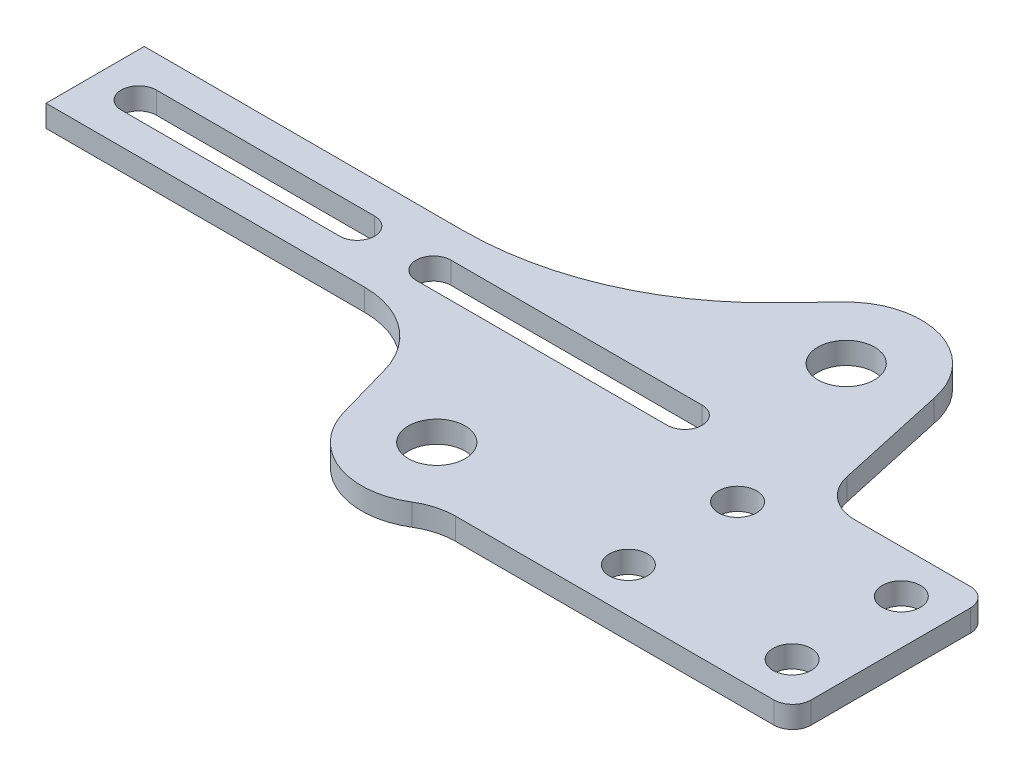
ISO-10303-21;
HEADER;
FILE_DESCRIPTION(('STEP AP214'),'2;1');
FILE_NAME('part.step','',(''),(''),'','','');
FILE_SCHEMA(('AUTOMOTIVE_DESIGN { 1 0 10303 214 1 1 1 1 }'));
ENDSEC;
DATA;
#1=APPLICATION_CONTEXT('core data for automotive mechanical design processes');
#2=APPLICATION_PROTOCOL_DEFINITION('international standard','automotive_design',2000,#1);
#3=PRODUCT_CONTEXT('',#1,'mechanical');
#4=PRODUCT('Part','Part','',(#3));
#5=PRODUCT_RELATED_PRODUCT_CATEGORY('part','',(#4));
#6=PRODUCT_DEFINITION_FORMATION('','',#4);
#7=PRODUCT_DEFINITION_CONTEXT('part definition',#1,'design');
#8=PRODUCT_DEFINITION('design','',#6,#7);
#9=PRODUCT_DEFINITION_SHAPE('','',#8);
#10=(LENGTH_UNIT() NAMED_UNIT(*) SI_UNIT(.MILLI.,.METRE.));
#11=(NAMED_UNIT(*) PLANE_ANGLE_UNIT() SI_UNIT($,.RADIAN.));
#12=(NAMED_UNIT(*) SI_UNIT($,.STERADIAN.) SOLID_ANGLE_UNIT());
#13=UNCERTAINTY_MEASURE_WITH_UNIT(LENGTH_MEASURE(1.E-05),#10,'distance_accuracy_value','');
#14=(GEOMETRIC_REPRESENTATION_CONTEXT(3) GLOBAL_UNCERTAINTY_ASSIGNED_CONTEXT((#13)) GLOBAL_UNIT_ASSIGNED_CONTEXT((#10,
#11,#12)) REPRESENTATION_CONTEXT('',''));
#15=CARTESIAN_POINT('',(0.,0.,0.));
#16=DIRECTION('',(0.,0.,1.));
#17=DIRECTION('',(1.,0.,0.));
#18=AXIS2_PLACEMENT_3D('',#15,#16,#17);
#19=CARTESIAN_POINT('',(0.,2.,-14.));
#20=DIRECTION('',(0.,0.,-1.));
#21=DIRECTION('',(-1.,0.,0.));
#22=AXIS2_PLACEMENT_3D('',#19,#20,#21);
#23=PLANE('',#22);
#24=DIRECTION('',(1.,0.,0.));
#25=VECTOR('',#24,1.);
#26=CARTESIAN_POINT('',(0.,0.,-14.));
#27=LINE('',#26,#25);
#28=CARTESIAN_POINT('',(6.79440726035871,0.,-14.));
#29=VERTEX_POINT('',#28);
#30=CARTESIAN_POINT('',(17.3739461759441,0.,-14.));
#31=VERTEX_POINT('',#30);
#32=EDGE_CURVE('E510',#29,#31,#27,.T.);
#33=ORIENTED_EDGE('',*,*,#32,.F.);
#34=DIRECTION('',(0.,-1.,0.));
#35=VECTOR('',#34,1.);
#36=CARTESIAN_POINT('',(6.79440726035871,2.,-14.));
#37=LINE('',#36,#35);
#38=CARTESIAN_POINT('',(6.79440726035871,2.,-14.));
#39=VERTEX_POINT('',#38);
#40=EDGE_CURVE('E374',#39,#29,#37,.T.);
#41=ORIENTED_EDGE('',*,*,#40,.F.);
#42=DIRECTION('',(1.,0.,0.));
#43=VECTOR('',#42,1.);
#44=CARTESIAN_POINT('',(0.,2.,-14.));
#45=LINE('',#44,#43);
#46=CARTESIAN_POINT('',(17.3739461759441,2.,-14.));
#47=VERTEX_POINT('',#46);
#48=EDGE_CURVE('E472',#39,#47,#45,.T.);
#49=ORIENTED_EDGE('',*,*,#48,.T.);
#50=DIRECTION('',(0.,-1.,0.));
#51=VECTOR('',#50,1.);
#52=CARTESIAN_POINT('',(17.3739461759441,2.,-14.));
#53=LINE('',#52,#51);
#54=EDGE_CURVE('E482',#47,#31,#53,.T.);
#55=ORIENTED_EDGE('',*,*,#54,.T.);
#56=EDGE_LOOP('',(#33,#41,#49,#55));
#57=FACE_BOUND('',#56,.T.);
#58=ADVANCED_FACE('F45',(#57),#23,.T.);
#59=CARTESIAN_POINT('',(0.,2.,-19.0035259776527));
#60=DIRECTION('',(0.,0.,-1.));
#61=DIRECTION('',(-1.,0.,0.));
#62=AXIS2_PLACEMENT_3D('',#59,#60,#61);
#63=PLANE('',#62);
#64=DIRECTION('',(1.,0.,0.));
#65=VECTOR('',#64,1.);
#66=CARTESIAN_POINT('',(0.,2.,-19.0035259776527));
#67=LINE('',#66,#65);
#68=CARTESIAN_POINT('',(-63.2934722012444,2.,-19.0035259776527));
#69=VERTEX_POINT('',#68);
#70=CARTESIAN_POINT('',(-34.1349039997192,2.,-19.0035259776527));
#71=VERTEX_POINT('',#70);
#72=EDGE_CURVE('E475',#69,#71,#67,.T.);
#73=ORIENTED_EDGE('',*,*,#72,.T.);
#74=DIRECTION('',(0.,1.,0.));
#75=VECTOR('',#74,1.);
#76=CARTESIAN_POINT('',(-34.1349039997192,0.,-19.0035259776527));
#77=LINE('',#76,#75);
#78=CARTESIAN_POINT('',(-34.1349039997192,0.,-19.0035259776527));
#79=VERTEX_POINT('',#78);
#80=EDGE_CURVE('E406',#79,#71,#77,.T.);
#81=ORIENTED_EDGE('',*,*,#80,.F.);
#82=DIRECTION('',(1.,0.,0.));
#83=VECTOR('',#82,1.);
#84=CARTESIAN_POINT('',(0.,0.,-19.0035259776527));
#85=LINE('',#84,#83);
#86=CARTESIAN_POINT('',(-63.2934722012444,0.,-19.0035259776527));
#87=VERTEX_POINT('',#86);
#88=EDGE_CURVE('E513',#87,#79,#85,.T.);
#89=ORIENTED_EDGE('',*,*,#88,.F.);
#90=DIRECTION('',(0.,1.,0.));
#91=VECTOR('',#90,1.);
#92=CARTESIAN_POINT('',(-63.2934722012444,0.,-19.0035259776527));
#93=LINE('',#92,#91);
#94=EDGE_CURVE('E273',#87,#69,#93,.T.);
#95=ORIENTED_EDGE('',*,*,#94,.T.);
#96=EDGE_LOOP('',(#73,#81,#89,#95));
#97=FACE_BOUND('',#96,.T.);
#98=ADVANCED_FACE('F575',(#97),#63,.T.);
#99=CARTESIAN_POINT('',(0.,2.,-10.0035259776527));
#100=DIRECTION('',(0.,0.,1.));
#101=DIRECTION('',(1.,0.,0.));
#102=AXIS2_PLACEMENT_3D('',#99,#100,#101);
#103=PLANE('',#102);
#104=DIRECTION('',(-1.,0.,0.));
#105=VECTOR('',#104,1.);
#106=CARTESIAN_POINT('',(0.,0.,-10.0035259776527));
#107=LINE('',#106,#105);
#108=CARTESIAN_POINT('',(-34.0979895375053,0.,-10.0035259776527));
#109=VERTEX_POINT('',#108);
#110=CARTESIAN_POINT('',(-63.2934722012444,0.,-10.0035259776527));
#111=VERTEX_POINT('',#110);
#112=EDGE_CURVE('E448',#109,#111,#107,.T.);
#113=ORIENTED_EDGE('',*,*,#112,.F.);
#114=DIRECTION('',(0.,1.,0.));
#115=VECTOR('',#114,1.);
#116=CARTESIAN_POINT('',(-34.0979895375053,0.,-10.0035259776527));
#117=LINE('',#116,#115);
#118=CARTESIAN_POINT('',(-34.0979895375053,2.,-10.0035259776527));
#119=VERTEX_POINT('',#118);
#120=EDGE_CURVE('E431',#109,#119,#117,.T.);
#121=ORIENTED_EDGE('',*,*,#120,.T.);
#122=DIRECTION('',(-1.,0.,0.));
#123=VECTOR('',#122,1.);
#124=CARTESIAN_POINT('',(0.,2.,-10.0035259776527));
#125=LINE('',#124,#123);
#126=CARTESIAN_POINT('',(-63.2934722012444,2.,-10.0035259776527));
#127=VERTEX_POINT('',#126);
#128=EDGE_CURVE('E479',#119,#127,#125,.T.);
#129=ORIENTED_EDGE('',*,*,#128,.T.);
#130=DIRECTION('',(0.,1.,0.));
#131=VECTOR('',#130,1.);
#132=CARTESIAN_POINT('',(-63.2934722012444,0.,-10.0035259776527));
#133=LINE('',#132,#131);
#134=EDGE_CURVE('E268',#111,#127,#133,.T.);
#135=ORIENTED_EDGE('',*,*,#134,.F.);
#136=EDGE_LOOP('',(#113,#121,#129,#135));
#137=FACE_BOUND('',#136,.T.);
#138=ADVANCED_FACE('F565',(#137),#103,.T.);
#139=CARTESIAN_POINT('',(0.,2.,3.99647402234725));
#140=DIRECTION('',(0.,0.,1.));
#141=DIRECTION('',(1.,0.,0.));
#142=AXIS2_PLACEMENT_3D('',#139,#140,#141);
#143=PLANE('',#142);
#144=DIRECTION('',(-1.,0.,0.));
#145=VECTOR('',#144,1.);
#146=CARTESIAN_POINT('',(0.,2.,3.99647402234725));
#147=LINE('',#146,#145);
#148=CARTESIAN_POINT('',(17.3739461759441,2.,3.99647402234725));
#149=VERTEX_POINT('',#148);
#150=CARTESIAN_POINT('',(-11.7678988907769,2.,3.99647402234725));
#151=VERTEX_POINT('',#150);
#152=EDGE_CURVE('E468',#149,#151,#147,.T.);
#153=ORIENTED_EDGE('',*,*,#152,.T.);
#154=DIRECTION('',(0.,-1.,0.));
#155=VECTOR('',#154,1.);
#156=CARTESIAN_POINT('',(-11.7678988907769,0.,3.99647402234725));
#157=LINE('',#156,#155);
#158=CARTESIAN_POINT('',(-11.7678988907769,0.,3.99647402234725));
#159=VERTEX_POINT('',#158);
#160=EDGE_CURVE('E530',#151,#159,#157,.T.);
#161=ORIENTED_EDGE('',*,*,#160,.T.);
#162=DIRECTION('',(-1.,0.,0.));
#163=VECTOR('',#162,1.);
#164=CARTESIAN_POINT('',(0.,0.,3.99647402234725));
#165=LINE('',#164,#163);
#166=CARTESIAN_POINT('',(17.3739461759441,0.,3.99647402234725));
#167=VERTEX_POINT('',#166);
#168=EDGE_CURVE('E506',#167,#159,#165,.T.);
#169=ORIENTED_EDGE('',*,*,#168,.F.);
#170=DIRECTION('',(0.,-1.,0.));
#171=VECTOR('',#170,1.);
#172=CARTESIAN_POINT('',(17.3739461759441,2.,3.99647402234725));
#173=LINE('',#172,#171);
#174=EDGE_CURVE('E522',#149,#167,#173,.T.);
#175=ORIENTED_EDGE('',*,*,#174,.F.);
#176=EDGE_LOOP('',(#153,#161,#169,#175));
#177=FACE_BOUND('',#176,.T.);
#178=ADVANCED_FACE('F544',(#177),#143,.T.);
#179=CARTESIAN_POINT('',(-5.99999999999999,2.,-26.0035259776527));
#180=DIRECTION('',(0.,-1.,0.));
#181=DIRECTION('',(0.,0.,-1.));
#182=AXIS2_PLACEMENT_3D('',#179,#180,#181);
#183=CYLINDRICAL_SURFACE('',#182,2.6);
#184=CARTESIAN_POINT('',(-5.99999999999999,2.,-26.0035259776527));
#185=DIRECTION('',(0.,1.,0.));
#186=DIRECTION('',(0.,0.,1.));
#187=AXIS2_PLACEMENT_3D('',#184,#185,#186);
#188=CIRCLE('',#187,2.6);
#189=CARTESIAN_POINT('',(-5.99999999999999,2.,-23.4035259776527));
#190=VERTEX_POINT('',#189);
#191=EDGE_CURVE('E464',#190,#190,#188,.T.);
#192=ORIENTED_EDGE('',*,*,#191,.T.);
#193=EDGE_LOOP('',(#192));
#194=FACE_BOUND('',#193,.T.);
#195=CARTESIAN_POINT('',(-5.99999999999999,0.,-26.0035259776527));
#196=DIRECTION('',(0.,1.,0.));
#197=DIRECTION('',(0.,0.,1.));
#198=AXIS2_PLACEMENT_3D('',#195,#196,#197);
#199=CIRCLE('',#198,2.6);
#200=CARTESIAN_POINT('',(-5.99999999999999,0.,-23.4035259776527));
#201=VERTEX_POINT('',#200);
#202=EDGE_CURVE('E502',#201,#201,#199,.T.);
#203=ORIENTED_EDGE('',*,*,#202,.F.);
#204=EDGE_LOOP('',(#203));
#205=FACE_BOUND('',#204,.T.);
#206=ADVANCED_FACE('F628',(#194,#205),#183,.F.);
#207=CARTESIAN_POINT('',(-18.5,2.,-1.00352597765274));
#208=DIRECTION('',(0.,-1.,0.));
#209=DIRECTION('',(0.,0.,-1.));
#210=AXIS2_PLACEMENT_3D('',#207,#208,#209);
#211=CYLINDRICAL_SURFACE('',#210,2.6);
#212=CARTESIAN_POINT('',(-18.5,2.,-1.00352597765274));
#213=DIRECTION('',(0.,1.,0.));
#214=DIRECTION('',(0.,0.,1.));
#215=AXIS2_PLACEMENT_3D('',#212,#213,#214);
#216=CIRCLE('',#215,2.6);
#217=CARTESIAN_POINT('',(-18.5,2.,1.59647402234726));
#218=VERTEX_POINT('',#217);
#219=EDGE_CURVE('E460',#218,#218,#216,.T.);
#220=ORIENTED_EDGE('',*,*,#219,.T.);
#221=EDGE_LOOP('',(#220));
#222=FACE_BOUND('',#221,.T.);
#223=CARTESIAN_POINT('',(-18.5,0.,-1.00352597765274));
#224=DIRECTION('',(0.,1.,0.));
#225=DIRECTION('',(0.,0.,1.));
#226=AXIS2_PLACEMENT_3D('',#223,#224,#225);
#227=CIRCLE('',#226,2.6);
#228=CARTESIAN_POINT('',(-18.5,0.,1.59647402234726));
#229=VERTEX_POINT('',#228);
#230=EDGE_CURVE('E498',#229,#229,#227,.T.);
#231=ORIENTED_EDGE('',*,*,#230,.F.);
#232=EDGE_LOOP('',(#231));
#233=FACE_BOUND('',#232,.T.);
#234=ADVANCED_FACE('F631',(#222,#233),#211,.F.);
#235=CARTESIAN_POINT('',(15.,2.,-10.0531735870855));
#236=DIRECTION('',(0.,-1.,0.));
#237=DIRECTION('',(0.,0.,-1.));
#238=AXIS2_PLACEMENT_3D('',#235,#236,#237);
#239=CYLINDRICAL_SURFACE('',#238,1.75);
#240=CARTESIAN_POINT('',(15.,2.,-10.0531735870855));
#241=DIRECTION('',(0.,1.,0.));
#242=DIRECTION('',(0.,0.,1.));
#243=AXIS2_PLACEMENT_3D('',#240,#241,#242);
#244=CIRCLE('',#243,1.75);
#245=CARTESIAN_POINT('',(15.,2.,-8.30317358708548));
#246=VERTEX_POINT('',#245);
#247=EDGE_CURVE('E456',#246,#246,#244,.T.);
#248=ORIENTED_EDGE('',*,*,#247,.T.);
#249=EDGE_LOOP('',(#248));
#250=FACE_BOUND('',#249,.T.);
#251=CARTESIAN_POINT('',(15.,0.,-10.0531735870855));
#252=DIRECTION('',(0.,1.,0.));
#253=DIRECTION('',(0.,0.,1.));
#254=AXIS2_PLACEMENT_3D('',#251,#252,#253);
#255=CIRCLE('',#254,1.75);
#256=CARTESIAN_POINT('',(15.,0.,-8.30317358708548));
#257=VERTEX_POINT('',#256);
#258=EDGE_CURVE('E494',#257,#257,#255,.T.);
#259=ORIENTED_EDGE('',*,*,#258,.F.);
#260=EDGE_LOOP('',(#259));
#261=FACE_BOUND('',#260,.T.);
#262=ADVANCED_FACE('F635',(#250,#261),#239,.F.);
#263=CARTESIAN_POINT('',(0.,2.,-10.0531735870854));
#264=DIRECTION('',(0.,-1.,0.));
#265=DIRECTION('',(0.,0.,-1.));
#266=AXIS2_PLACEMENT_3D('',#263,#264,#265);
#267=CYLINDRICAL_SURFACE('',#266,1.75);
#268=CARTESIAN_POINT('',(0.,2.,-10.0531735870854));
#269=DIRECTION('',(0.,1.,0.));
#270=DIRECTION('',(0.,0.,1.));
#271=AXIS2_PLACEMENT_3D('',#268,#269,#270);
#272=CIRCLE('',#271,1.75);
#273=CARTESIAN_POINT('',(0.,2.,-8.30317358708538));
#274=VERTEX_POINT('',#273);
#275=EDGE_CURVE('E452',#274,#274,#272,.T.);
#276=ORIENTED_EDGE('',*,*,#275,.T.);
#277=EDGE_LOOP('',(#276));
#278=FACE_BOUND('',#277,.T.);
#279=CARTESIAN_POINT('',(0.,0.,-10.0531735870854));
#280=DIRECTION('',(0.,1.,0.));
#281=DIRECTION('',(0.,0.,1.));
#282=AXIS2_PLACEMENT_3D('',#279,#280,#281);
#283=CIRCLE('',#282,1.75);
#284=CARTESIAN_POINT('',(0.,0.,-8.30317358708538));
#285=VERTEX_POINT('',#284);
#286=EDGE_CURVE('E490',#285,#285,#283,.T.);
#287=ORIENTED_EDGE('',*,*,#286,.F.);
#288=EDGE_LOOP('',(#287));
#289=FACE_BOUND('',#288,.T.);
#290=ADVANCED_FACE('F639',(#278,#289),#267,.F.);
#291=CARTESIAN_POINT('',(1.07552855510562E-13,2.,-0.0531735870853787));
#292=DIRECTION('',(0.,-1.,0.));
#293=DIRECTION('',(0.,0.,-1.));
#294=AXIS2_PLACEMENT_3D('',#291,#292,#293);
#295=CYLINDRICAL_SURFACE('',#294,1.75);
#296=CARTESIAN_POINT('',(1.07552855510562E-13,2.,-0.0531735870853787));
#297=DIRECTION('',(0.,1.,0.));
#298=DIRECTION('',(0.,0.,1.));
#299=AXIS2_PLACEMENT_3D('',#296,#297,#298);
#300=CIRCLE('',#299,1.75);
#301=CARTESIAN_POINT('',(1.07552855510562E-13,2.,1.69682641291462));
#302=VERTEX_POINT('',#301);
#303=EDGE_CURVE('E447',#302,#302,#300,.T.);
#304=ORIENTED_EDGE('',*,*,#303,.T.);
#305=EDGE_LOOP('',(#304));
#306=FACE_BOUND('',#305,.T.);
#307=CARTESIAN_POINT('',(1.07552855510562E-13,0.,-0.0531735870853787));
#308=DIRECTION('',(0.,1.,0.));
#309=DIRECTION('',(0.,0.,1.));
#310=AXIS2_PLACEMENT_3D('',#307,#308,#309);
#311=CIRCLE('',#310,1.75);
#312=CARTESIAN_POINT('',(1.07552855510562E-13,0.,1.69682641291462));
#313=VERTEX_POINT('',#312);
#314=EDGE_CURVE('E486',#313,#313,#311,.T.);
#315=ORIENTED_EDGE('',*,*,#314,.F.);
#316=EDGE_LOOP('',(#315));
#317=FACE_BOUND('',#316,.T.);
#318=ADVANCED_FACE('F643',(#306,#317),#295,.F.);
#319=CARTESIAN_POINT('',(15.0000000000001,2.,-0.0531735870854828));
#320=DIRECTION('',(0.,-1.,0.));
#321=DIRECTION('',(0.,0.,-1.));
#322=AXIS2_PLACEMENT_3D('',#319,#320,#321);
#323=CYLINDRICAL_SURFACE('',#322,1.75);
#324=CARTESIAN_POINT('',(15.0000000000001,2.,-0.0531735870854828));
#325=DIRECTION('',(0.,1.,0.));
#326=DIRECTION('',(0.,0.,1.));
#327=AXIS2_PLACEMENT_3D('',#324,#325,#326);
#328=CIRCLE('',#327,1.75);
#329=CARTESIAN_POINT('',(15.0000000000001,2.,1.69682641291452));
#330=VERTEX_POINT('',#329);
#331=EDGE_CURVE('E443',#330,#330,#328,.T.);
#332=ORIENTED_EDGE('',*,*,#331,.T.);
#333=EDGE_LOOP('',(#332));
#334=FACE_BOUND('',#333,.T.);
#335=CARTESIAN_POINT('',(15.0000000000001,0.,-0.0531735870854828));
#336=DIRECTION('',(0.,1.,0.));
#337=DIRECTION('',(0.,0.,1.));
#338=AXIS2_PLACEMENT_3D('',#335,#336,#337);
#339=CIRCLE('',#338,1.75);
#340=CARTESIAN_POINT('',(15.0000000000001,0.,1.69682641291452));
#341=VERTEX_POINT('',#340);
#342=EDGE_CURVE('E435',#341,#341,#339,.T.);
#343=ORIENTED_EDGE('',*,*,#342,.F.);
#344=EDGE_LOOP('',(#343));
#345=FACE_BOUND('',#344,.T.);
#346=ADVANCED_FACE('F646',(#334,#345),#323,.F.);
#347=CARTESIAN_POINT('',(0.,2.,0.));
#348=DIRECTION('',(0.,1.,0.));
#349=DIRECTION('',(0.,0.,1.));
#350=AXIS2_PLACEMENT_3D('',#347,#348,#349);
#351=PLANE('',#350);
#352=DIRECTION('',(1.,0.,0.));
#353=VECTOR('',#352,1.);
#354=CARTESIAN_POINT('',(0.,2.,-12.9035259776527));
#355=LINE('',#354,#353);
#356=CARTESIAN_POINT('',(-32.2934722012444,2.,-12.9035259776527));
#357=VERTEX_POINT('',#356);
#358=CARTESIAN_POINT('',(-9.29347220124441,2.,-12.9035259776527));
#359=VERTEX_POINT('',#358);
#360=EDGE_CURVE('E61',#357,#359,#355,.T.);
#361=ORIENTED_EDGE('',*,*,#360,.F.);
#362=CARTESIAN_POINT('',(-32.2934722012444,2.,-14.5035259776527));
#363=DIRECTION('',(0.,1.,0.));
#364=DIRECTION('',(0.,0.,1.));
#365=AXIS2_PLACEMENT_3D('',#362,#363,#364);
#366=CIRCLE('',#365,1.6);
#367=CARTESIAN_POINT('',(-32.2934722012444,2.,-16.1035259776527));
#368=VERTEX_POINT('',#367);
#369=EDGE_CURVE('E318',#368,#357,#366,.T.);
#370=ORIENTED_EDGE('',*,*,#369,.F.);
#371=DIRECTION('',(1.,0.,0.));
#372=VECTOR('',#371,1.);
#373=CARTESIAN_POINT('',(0.,2.,-16.1035259776527));
#374=LINE('',#373,#372);
#375=CARTESIAN_POINT('',(-9.29347220124441,2.,-16.1035259776527));
#376=VERTEX_POINT('',#375);
#377=EDGE_CURVE('E335',#368,#376,#374,.T.);
#378=ORIENTED_EDGE('',*,*,#377,.T.);
#379=CARTESIAN_POINT('',(-9.29347220124441,2.,-14.5035259776527));
#380=DIRECTION('',(0.,1.,0.));
#381=DIRECTION('',(0.,0.,1.));
#382=AXIS2_PLACEMENT_3D('',#379,#380,#381);
#383=CIRCLE('',#382,1.6);
#384=EDGE_CURVE('E332',#359,#376,#383,.T.);
#385=ORIENTED_EDGE('',*,*,#384,.F.);
#386=EDGE_LOOP('',(#361,#370,#378,#385));
#387=FACE_BOUND('',#386,.T.);
#388=ORIENTED_EDGE('',*,*,#48,.F.);
#389=CARTESIAN_POINT('',(6.79440726035871,2.,-17.8603036294451));
#390=DIRECTION('',(0.,-1.,0.));
#391=DIRECTION('',(0.,0.,-1.));
#392=AXIS2_PLACEMENT_3D('',#389,#390,#391);
#393=CIRCLE('',#392,3.86030362944511);
#394=CARTESIAN_POINT('',(3.02366762850154,2.,-17.0335831565834));
#395=VERTEX_POINT('',#394);
#396=EDGE_CURVE('E357',#395,#39,#393,.F.);
#397=ORIENTED_EDGE('',*,*,#396,.F.);
#398=DIRECTION('',(0.214159442422035,0.,0.976798716840621));
#399=VECTOR('',#398,1.);
#400=CARTESIAN_POINT('',(6.44825597818781,2.,-1.41375585478843));
#401=LINE('',#400,#399);
#402=CARTESIAN_POINT('',(0.778699812524267,2.,-27.2730648119085));
#403=VERTEX_POINT('',#402);
#404=EDGE_CURVE('E353',#403,#395,#401,.T.);
#405=ORIENTED_EDGE('',*,*,#404,.F.);
#406=CARTESIAN_POINT('',(-5.99999999999999,2.,-26.0035259776527));
#407=DIRECTION('',(0.,1.,0.));
#408=DIRECTION('',(0.,0.,1.));
#409=AXIS2_PLACEMENT_3D('',#406,#407,#408);
#410=CIRCLE('',#409,6.89655711206686);
#411=CARTESIAN_POINT('',(-10.9549551999218,2.,-30.8004957468682));
#412=VERTEX_POINT('',#411);
#413=EDGE_CURVE('E385',#403,#412,#410,.T.);
#414=ORIENTED_EDGE('',*,*,#413,.T.);
#415=DIRECTION('',(-0.695560073130153,0.,0.718467942685807));
#416=VECTOR('',#415,1.);
#417=CARTESIAN_POINT('',(-21.0470723552482,2.,-20.3760005378473));
#418=LINE('',#417,#416);
#419=CARTESIAN_POINT('',(-14.1966138423574,2.,-27.4520749480158));
#420=VERTEX_POINT('',#419);
#421=EDGE_CURVE('E373',#412,#420,#418,.T.);
#422=ORIENTED_EDGE('',*,*,#421,.T.);
#423=CARTESIAN_POINT('',(-34.1349039997192,2.,-46.7546460663622));
#424=DIRECTION('',(0.,1.,0.));
#425=DIRECTION('',(0.,0.,1.));
#426=AXIS2_PLACEMENT_3D('',#423,#424,#425);
#427=CIRCLE('',#426,27.7511200887094);
#428=EDGE_CURVE('E395',#420,#71,#427,.F.);
#429=ORIENTED_EDGE('',*,*,#428,.T.);
#430=ORIENTED_EDGE('',*,*,#72,.F.);
#431=DIRECTION('',(0.,0.,-1.));
#432=VECTOR('',#431,1.);
#433=CARTESIAN_POINT('',(-63.2934722012444,2.,0.));
#434=LINE('',#433,#432);
#435=EDGE_CURVE('E242',#127,#69,#434,.T.);
#436=ORIENTED_EDGE('',*,*,#435,.F.);
#437=ORIENTED_EDGE('',*,*,#128,.F.);
#438=CARTESIAN_POINT('',(-34.0979895375053,2.,-2.23345198833755));
#439=DIRECTION('',(0.,1.,0.));
#440=DIRECTION('',(0.,0.,1.));
#441=AXIS2_PLACEMENT_3D('',#438,#439,#440);
#442=CIRCLE('',#441,7.77007398931519);
#443=CARTESIAN_POINT('',(-26.6242718005677,2.,-4.35891499390062));
#444=VERTEX_POINT('',#443);
#445=EDGE_CURVE('E405',#444,#119,#442,.T.);
#446=ORIENTED_EDGE('',*,*,#445,.F.);
#447=DIRECTION('',(-0.273544757551324,0.,-0.961859275370461));
#448=VECTOR('',#447,1.);
#449=CARTESIAN_POINT('',(-23.4851835524946,2.,6.67899037355664));
#450=LINE('',#449,#448);
#451=CARTESIAN_POINT('',(-25.1335174263636,2.,0.882991065506443));
#452=VERTEX_POINT('',#451);
#453=EDGE_CURVE('E425',#452,#444,#450,.T.);
#454=ORIENTED_EDGE('',*,*,#453,.F.);
#455=CARTESIAN_POINT('',(-18.5,2.,-1.00352597765274));
#456=DIRECTION('',(0.,1.,0.));
#457=DIRECTION('',(0.,0.,1.));
#458=AXIS2_PLACEMENT_3D('',#455,#456,#457);
#459=CIRCLE('',#458,6.89655711206686);
#460=CARTESIAN_POINT('',(-14.8999446223889,2.,4.87882910157642));
#461=VERTEX_POINT('',#460);
#462=EDGE_CURVE('E415',#452,#461,#459,.T.);
#463=ORIENTED_EDGE('',*,*,#462,.T.);
#464=CARTESIAN_POINT('',(-11.7678988907769,2.,9.99647402234725));
#465=DIRECTION('',(0.,1.,0.));
#466=DIRECTION('',(0.,0.,1.));
#467=AXIS2_PLACEMENT_3D('',#464,#465,#466);
#468=CIRCLE('',#467,6.);
#469=EDGE_CURVE('E54',#461,#151,#468,.F.);
#470=ORIENTED_EDGE('',*,*,#469,.T.);
#471=ORIENTED_EDGE('',*,*,#152,.F.);
#472=CARTESIAN_POINT('',(17.3739461759441,2.,2.28514277268248));
#473=DIRECTION('',(0.,1.,0.));
#474=DIRECTION('',(0.,0.,-1.));
#475=AXIS2_PLACEMENT_3D('',#472,#473,#474);
#476=CIRCLE('',#475,1.71133124966477);
#477=CARTESIAN_POINT('',(19.0852774256088,2.,2.28514277268248));
#478=VERTEX_POINT('',#477);
#479=EDGE_CURVE('E272',#149,#478,#476,.T.);
#480=ORIENTED_EDGE('',*,*,#479,.T.);
#481=DIRECTION('',(0.,0.,-1.));
#482=VECTOR('',#481,1.);
#483=CARTESIAN_POINT('',(19.0852774256088,2.,-12.2886687503352));
#484=LINE('',#483,#482);
#485=CARTESIAN_POINT('',(19.0852774256088,2.,-12.2886687503352));
#486=VERTEX_POINT('',#485);
#487=EDGE_CURVE('E301',#478,#486,#484,.T.);
#488=ORIENTED_EDGE('',*,*,#487,.T.);
#489=CARTESIAN_POINT('',(17.3739461759441,2.,-12.2886687503352));
#490=DIRECTION('',(0.,1.,0.));
#491=DIRECTION('',(0.,0.,1.));
#492=AXIS2_PLACEMENT_3D('',#489,#490,#491);
#493=CIRCLE('',#492,1.71133124966477);
#494=EDGE_CURVE('E289',#486,#47,#493,.T.);
#495=ORIENTED_EDGE('',*,*,#494,.T.);
#496=EDGE_LOOP('',(#388,#397,#405,#414,#422,#429,#430,#436,#437,#446,#454,#463,#470,#471,#480,
#488,#495));
#497=FACE_BOUND('',#496,.T.);
#498=ORIENTED_EDGE('',*,*,#331,.F.);
#499=EDGE_LOOP('',(#498));
#500=FACE_BOUND('',#499,.T.);
#501=ORIENTED_EDGE('',*,*,#303,.F.);
#502=EDGE_LOOP('',(#501));
#503=FACE_BOUND('',#502,.T.);
#504=ORIENTED_EDGE('',*,*,#275,.F.);
#505=EDGE_LOOP('',(#504));
#506=FACE_BOUND('',#505,.T.);
#507=ORIENTED_EDGE('',*,*,#247,.F.);
#508=EDGE_LOOP('',(#507));
#509=FACE_BOUND('',#508,.T.);
#510=ORIENTED_EDGE('',*,*,#219,.F.);
#511=EDGE_LOOP('',(#510));
#512=FACE_BOUND('',#511,.T.);
#513=ORIENTED_EDGE('',*,*,#191,.F.);
#514=EDGE_LOOP('',(#513));
#515=FACE_BOUND('',#514,.T.);
#516=CARTESIAN_POINT('',(-39.2934722012444,2.,-14.5035259776527));
#517=DIRECTION('',(0.,1.,0.));
#518=DIRECTION('',(0.,0.,1.));
#519=AXIS2_PLACEMENT_3D('',#516,#517,#518);
#520=CIRCLE('',#519,1.6);
#521=CARTESIAN_POINT('',(-39.2934722012444,2.,-12.9035259776527));
#522=VERTEX_POINT('',#521);
#523=CARTESIAN_POINT('',(-39.2934722012444,2.,-16.1035259776527));
#524=VERTEX_POINT('',#523);
#525=EDGE_CURVE('E257',#522,#524,#520,.T.);
#526=ORIENTED_EDGE('',*,*,#525,.F.);
#527=DIRECTION('',(1.,0.,0.));
#528=VECTOR('',#527,1.);
#529=CARTESIAN_POINT('',(0.,2.,-12.9035259776527));
#530=LINE('',#529,#528);
#531=CARTESIAN_POINT('',(-59.2934722012444,2.,-12.9035259776527));
#532=VERTEX_POINT('',#531);
#533=EDGE_CURVE('E230',#532,#522,#530,.T.);
#534=ORIENTED_EDGE('',*,*,#533,.F.);
#535=CARTESIAN_POINT('',(-59.2934722012444,2.,-14.5035259776527));
#536=DIRECTION('',(0.,1.,0.));
#537=DIRECTION('',(0.,0.,1.));
#538=AXIS2_PLACEMENT_3D('',#535,#536,#537);
#539=CIRCLE('',#538,1.6);
#540=CARTESIAN_POINT('',(-59.2934722012444,2.,-16.1035259776527));
#541=VERTEX_POINT('',#540);
#542=EDGE_CURVE('E262',#541,#532,#539,.T.);
#543=ORIENTED_EDGE('',*,*,#542,.F.);
#544=DIRECTION('',(1.,0.,0.));
#545=VECTOR('',#544,1.);
#546=CARTESIAN_POINT('',(0.,2.,-16.1035259776527));
#547=LINE('',#546,#545);
#548=EDGE_CURVE('E246',#541,#524,#547,.T.);
#549=ORIENTED_EDGE('',*,*,#548,.T.);
#550=EDGE_LOOP('',(#526,#534,#543,#549));
#551=FACE_BOUND('',#550,.T.);
#552=ADVANCED_FACE('F536',(#387,#497,#500,#503,#506,#509,#512,#515,#551),#351,.T.);
#553=CARTESIAN_POINT('',(0.,0.,0.));
#554=DIRECTION('',(0.,1.,0.));
#555=DIRECTION('',(0.,0.,1.));
#556=AXIS2_PLACEMENT_3D('',#553,#554,#555);
#557=PLANE('',#556);
#558=CARTESIAN_POINT('',(-32.2934722012444,0.,-14.5035259776527));
#559=DIRECTION('',(0.,1.,0.));
#560=DIRECTION('',(0.,0.,1.));
#561=AXIS2_PLACEMENT_3D('',#558,#559,#560);
#562=CIRCLE('',#561,1.6);
#563=CARTESIAN_POINT('',(-32.2934722012444,0.,-16.1035259776527));
#564=VERTEX_POINT('',#563);
#565=CARTESIAN_POINT('',(-32.2934722012444,0.,-12.9035259776527));
#566=VERTEX_POINT('',#565);
#567=EDGE_CURVE('E325',#564,#566,#562,.T.);
#568=ORIENTED_EDGE('',*,*,#567,.T.);
#569=DIRECTION('',(1.,0.,0.));
#570=VECTOR('',#569,1.);
#571=CARTESIAN_POINT('',(0.,0.,-12.9035259776527));
#572=LINE('',#571,#570);
#573=CARTESIAN_POINT('',(-9.29347220124441,0.,-12.9035259776527));
#574=VERTEX_POINT('',#573);
#575=EDGE_CURVE('E313',#566,#574,#572,.T.);
#576=ORIENTED_EDGE('',*,*,#575,.T.);
#577=CARTESIAN_POINT('',(-9.29347220124441,0.,-14.5035259776527));
#578=DIRECTION('',(0.,1.,0.));
#579=DIRECTION('',(0.,0.,1.));
#580=AXIS2_PLACEMENT_3D('',#577,#578,#579);
#581=CIRCLE('',#580,1.6);
#582=CARTESIAN_POINT('',(-9.29347220124441,0.,-16.1035259776527));
#583=VERTEX_POINT('',#582);
#584=EDGE_CURVE('E317',#574,#583,#581,.T.);
#585=ORIENTED_EDGE('',*,*,#584,.T.);
#586=DIRECTION('',(1.,0.,0.));
#587=VECTOR('',#586,1.);
#588=CARTESIAN_POINT('',(0.,0.,-16.1035259776527));
#589=LINE('',#588,#587);
#590=EDGE_CURVE('E322',#564,#583,#589,.T.);
#591=ORIENTED_EDGE('',*,*,#590,.F.);
#592=EDGE_LOOP('',(#568,#576,#585,#591));
#593=FACE_BOUND('',#592,.T.);
#594=CARTESIAN_POINT('',(6.79440726035871,0.,-17.8603036294451));
#595=DIRECTION('',(0.,-1.,0.));
#596=DIRECTION('',(0.,0.,-1.));
#597=AXIS2_PLACEMENT_3D('',#594,#595,#596);
#598=CIRCLE('',#597,3.86030362944511);
#599=CARTESIAN_POINT('',(3.02366762850154,0.,-17.0335831565834));
#600=VERTEX_POINT('',#599);
#601=EDGE_CURVE('E358',#600,#29,#598,.F.);
#602=ORIENTED_EDGE('',*,*,#601,.T.);
#603=ORIENTED_EDGE('',*,*,#32,.T.);
#604=CARTESIAN_POINT('',(17.3739461759441,0.,-12.2886687503352));
#605=DIRECTION('',(0.,1.,0.));
#606=DIRECTION('',(0.,0.,1.));
#607=AXIS2_PLACEMENT_3D('',#604,#605,#606);
#608=CIRCLE('',#607,1.71133124966477);
#609=CARTESIAN_POINT('',(19.0852774256088,0.,-12.2886687503352));
#610=VERTEX_POINT('',#609);
#611=EDGE_CURVE('E293',#610,#31,#608,.T.);
#612=ORIENTED_EDGE('',*,*,#611,.F.);
#613=DIRECTION('',(0.,0.,-1.));
#614=VECTOR('',#613,1.);
#615=CARTESIAN_POINT('',(19.0852774256088,0.,-12.2886687503352));
#616=LINE('',#615,#614);
#617=CARTESIAN_POINT('',(19.0852774256088,0.,2.28514277268248));
#618=VERTEX_POINT('',#617);
#619=EDGE_CURVE('E288',#618,#610,#616,.T.);
#620=ORIENTED_EDGE('',*,*,#619,.F.);
#621=CARTESIAN_POINT('',(17.3739461759441,0.,2.28514277268248));
#622=DIRECTION('',(0.,1.,0.));
#623=DIRECTION('',(0.,0.,-1.));
#624=AXIS2_PLACEMENT_3D('',#621,#622,#623);
#625=CIRCLE('',#624,1.71133124966477);
#626=EDGE_CURVE('E284',#167,#618,#625,.T.);
#627=ORIENTED_EDGE('',*,*,#626,.F.);
#628=ORIENTED_EDGE('',*,*,#168,.T.);
#629=CARTESIAN_POINT('',(-11.7678988907769,0.,9.99647402234725));
#630=DIRECTION('',(0.,1.,0.));
#631=DIRECTION('',(0.,0.,1.));
#632=AXIS2_PLACEMENT_3D('',#629,#630,#631);
#633=CIRCLE('',#632,6.);
#634=CARTESIAN_POINT('',(-14.8999446223889,0.,4.87882910157642));
#635=VERTEX_POINT('',#634);
#636=EDGE_CURVE('E11',#159,#635,#633,.T.);
#637=ORIENTED_EDGE('',*,*,#636,.T.);
#638=CARTESIAN_POINT('',(-18.5,0.,-1.00352597765274));
#639=DIRECTION('',(0.,1.,0.));
#640=DIRECTION('',(0.,0.,1.));
#641=AXIS2_PLACEMENT_3D('',#638,#639,#640);
#642=CIRCLE('',#641,6.89655711206686);
#643=CARTESIAN_POINT('',(-25.1335174263636,0.,0.882991065506443));
#644=VERTEX_POINT('',#643);
#645=EDGE_CURVE('E418',#644,#635,#642,.T.);
#646=ORIENTED_EDGE('',*,*,#645,.F.);
#647=DIRECTION('',(-0.273544757551324,0.,-0.961859275370461));
#648=VECTOR('',#647,1.);
#649=CARTESIAN_POINT('',(-23.4851835524946,0.,6.67899037355664));
#650=LINE('',#649,#648);
#651=CARTESIAN_POINT('',(-26.6242718005677,0.,-4.35891499390062));
#652=VERTEX_POINT('',#651);
#653=EDGE_CURVE('E414',#644,#652,#650,.T.);
#654=ORIENTED_EDGE('',*,*,#653,.T.);
#655=CARTESIAN_POINT('',(-34.0979895375053,0.,-2.23345198833755));
#656=DIRECTION('',(0.,1.,0.));
#657=DIRECTION('',(0.,0.,1.));
#658=AXIS2_PLACEMENT_3D('',#655,#656,#657);
#659=CIRCLE('',#658,7.77007398931519);
#660=EDGE_CURVE('E411',#652,#109,#659,.T.);
#661=ORIENTED_EDGE('',*,*,#660,.T.);
#662=ORIENTED_EDGE('',*,*,#112,.T.);
#663=DIRECTION('',(0.,0.,-1.));
#664=VECTOR('',#663,1.);
#665=CARTESIAN_POINT('',(-63.2934722012444,0.,0.));
#666=LINE('',#665,#664);
#667=EDGE_CURVE('E236',#111,#87,#666,.T.);
#668=ORIENTED_EDGE('',*,*,#667,.T.);
#669=ORIENTED_EDGE('',*,*,#88,.T.);
#670=CARTESIAN_POINT('',(-34.1349039997192,0.,-46.7546460663622));
#671=DIRECTION('',(0.,1.,0.));
#672=DIRECTION('',(0.,0.,1.));
#673=AXIS2_PLACEMENT_3D('',#670,#671,#672);
#674=CIRCLE('',#673,27.7511200887094);
#675=CARTESIAN_POINT('',(-14.1966138423574,0.,-27.4520749480158));
#676=VERTEX_POINT('',#675);
#677=EDGE_CURVE('E384',#676,#79,#674,.F.);
#678=ORIENTED_EDGE('',*,*,#677,.F.);
#679=DIRECTION('',(-0.695560073130153,0.,0.718467942685807));
#680=VECTOR('',#679,1.);
#681=CARTESIAN_POINT('',(-21.0470723552482,0.,-20.3760005378473));
#682=LINE('',#681,#680);
#683=CARTESIAN_POINT('',(-10.9549551999218,0.,-30.8004957468682));
#684=VERTEX_POINT('',#683);
#685=EDGE_CURVE('E380',#684,#676,#682,.T.);
#686=ORIENTED_EDGE('',*,*,#685,.F.);
#687=CARTESIAN_POINT('',(-5.99999999999999,0.,-26.0035259776527));
#688=DIRECTION('',(0.,1.,0.));
#689=DIRECTION('',(0.,0.,1.));
#690=AXIS2_PLACEMENT_3D('',#687,#688,#689);
#691=CIRCLE('',#690,6.89655711206686);
#692=CARTESIAN_POINT('',(0.778699812524268,0.,-27.2730648119085));
#693=VERTEX_POINT('',#692);
#694=EDGE_CURVE('E388',#693,#684,#691,.T.);
#695=ORIENTED_EDGE('',*,*,#694,.F.);
#696=DIRECTION('',(0.214159442422035,0.,0.976798716840621));
#697=VECTOR('',#696,1.);
#698=CARTESIAN_POINT('',(6.44825597818781,0.,-1.41375585478843));
#699=LINE('',#698,#697);
#700=EDGE_CURVE('E345',#693,#600,#699,.T.);
#701=ORIENTED_EDGE('',*,*,#700,.T.);
#702=EDGE_LOOP('',(#602,#603,#612,#620,#627,#628,#637,#646,#654,#661,#662,#668,#669,#678,#686,
#695,#701));
#703=FACE_BOUND('',#702,.T.);
#704=ORIENTED_EDGE('',*,*,#342,.T.);
#705=EDGE_LOOP('',(#704));
#706=FACE_BOUND('',#705,.T.);
#707=ORIENTED_EDGE('',*,*,#314,.T.);
#708=EDGE_LOOP('',(#707));
#709=FACE_BOUND('',#708,.T.);
#710=ORIENTED_EDGE('',*,*,#286,.T.);
#711=EDGE_LOOP('',(#710));
#712=FACE_BOUND('',#711,.T.);
#713=ORIENTED_EDGE('',*,*,#258,.T.);
#714=EDGE_LOOP('',(#713));
#715=FACE_BOUND('',#714,.T.);
#716=ORIENTED_EDGE('',*,*,#230,.T.);
#717=EDGE_LOOP('',(#716));
#718=FACE_BOUND('',#717,.T.);
#719=ORIENTED_EDGE('',*,*,#202,.T.);
#720=EDGE_LOOP('',(#719));
#721=FACE_BOUND('',#720,.T.);
#722=CARTESIAN_POINT('',(-39.2934722012444,0.,-14.5035259776527));
#723=DIRECTION('',(0.,1.,0.));
#724=DIRECTION('',(0.,0.,1.));
#725=AXIS2_PLACEMENT_3D('',#722,#723,#724);
#726=CIRCLE('',#725,1.6);
#727=CARTESIAN_POINT('',(-39.2934722012444,0.,-12.9035259776527));
#728=VERTEX_POINT('',#727);
#729=CARTESIAN_POINT('',(-39.2934722012444,0.,-16.1035259776527));
#730=VERTEX_POINT('',#729);
#731=EDGE_CURVE('E217',#728,#730,#726,.T.);
#732=ORIENTED_EDGE('',*,*,#731,.T.);
#733=DIRECTION('',(1.,0.,0.));
#734=VECTOR('',#733,1.);
#735=CARTESIAN_POINT('',(0.,0.,-16.1035259776527));
#736=LINE('',#735,#734);
#737=CARTESIAN_POINT('',(-59.2934722012444,0.,-16.1035259776527));
#738=VERTEX_POINT('',#737);
#739=EDGE_CURVE('E251',#738,#730,#736,.T.);
#740=ORIENTED_EDGE('',*,*,#739,.F.);
#741=CARTESIAN_POINT('',(-59.2934722012444,0.,-14.5035259776527));
#742=DIRECTION('',(0.,1.,0.));
#743=DIRECTION('',(0.,0.,1.));
#744=AXIS2_PLACEMENT_3D('',#741,#742,#743);
#745=CIRCLE('',#744,1.6);
#746=CARTESIAN_POINT('',(-59.2934722012444,0.,-12.9035259776527));
#747=VERTEX_POINT('',#746);
#748=EDGE_CURVE('E220',#738,#747,#745,.T.);
#749=ORIENTED_EDGE('',*,*,#748,.T.);
#750=DIRECTION('',(1.,0.,0.));
#751=VECTOR('',#750,1.);
#752=CARTESIAN_POINT('',(0.,0.,-12.9035259776527));
#753=LINE('',#752,#751);
#754=EDGE_CURVE('E212',#747,#728,#753,.T.);
#755=ORIENTED_EDGE('',*,*,#754,.T.);
#756=EDGE_LOOP('',(#732,#740,#749,#755));
#757=FACE_BOUND('',#756,.T.);
#758=ADVANCED_FACE('F214',(#593,#703,#706,#709,#712,#715,#718,#721,#757),#557,.F.);
#759=CARTESIAN_POINT('',(-18.5,0.,-1.00352597765274));
#760=DIRECTION('',(0.,1.,0.));
#761=DIRECTION('',(0.,0.,1.));
#762=AXIS2_PLACEMENT_3D('',#759,#760,#761);
#763=CYLINDRICAL_SURFACE('',#762,6.89655711206686);
#764=ORIENTED_EDGE('',*,*,#645,.T.);
#765=DIRECTION('',(0.,1.,0.));
#766=VECTOR('',#765,1.);
#767=CARTESIAN_POINT('',(-14.8999446223889,0.,4.87882910157642));
#768=LINE('',#767,#766);
#769=EDGE_CURVE('E526',#635,#461,#768,.T.);
#770=ORIENTED_EDGE('',*,*,#769,.T.);
#771=ORIENTED_EDGE('',*,*,#462,.F.);
#772=DIRECTION('',(0.,1.,0.));
#773=VECTOR('',#772,1.);
#774=CARTESIAN_POINT('',(-25.1335174263636,0.,0.882991065506443));
#775=LINE('',#774,#773);
#776=EDGE_CURVE('E436',#644,#452,#775,.T.);
#777=ORIENTED_EDGE('',*,*,#776,.F.);
#778=EDGE_LOOP('',(#764,#770,#771,#777));
#779=FACE_BOUND('',#778,.T.);
#780=ADVANCED_FACE('F551',(#779),#763,.T.);
#781=CARTESIAN_POINT('',(-34.0979895375053,0.,-2.23345198833755));
#782=DIRECTION('',(0.,1.,0.));
#783=DIRECTION('',(0.,0.,1.));
#784=AXIS2_PLACEMENT_3D('',#781,#782,#783);
#785=CYLINDRICAL_SURFACE('',#784,7.77007398931519);
#786=ORIENTED_EDGE('',*,*,#445,.T.);
#787=ORIENTED_EDGE('',*,*,#120,.F.);
#788=ORIENTED_EDGE('',*,*,#660,.F.);
#789=DIRECTION('',(0.,1.,0.));
#790=VECTOR('',#789,1.);
#791=CARTESIAN_POINT('',(-26.6242718005677,0.,-4.35891499390062));
#792=LINE('',#791,#790);
#793=EDGE_CURVE('E422',#652,#444,#792,.T.);
#794=ORIENTED_EDGE('',*,*,#793,.T.);
#795=EDGE_LOOP('',(#786,#787,#788,#794));
#796=FACE_BOUND('',#795,.T.);
#797=ADVANCED_FACE('F561',(#796),#785,.F.);
#798=CARTESIAN_POINT('',(-23.4851835524946,0.,6.67899037355664));
#799=DIRECTION('',(0.961859275370461,0.,-0.273544757551324));
#800=DIRECTION('',(-0.273544757551324,0.,-0.961859275370461));
#801=AXIS2_PLACEMENT_3D('',#798,#799,#800);
#802=PLANE('',#801);
#803=ORIENTED_EDGE('',*,*,#453,.T.);
#804=ORIENTED_EDGE('',*,*,#793,.F.);
#805=ORIENTED_EDGE('',*,*,#653,.F.);
#806=ORIENTED_EDGE('',*,*,#776,.T.);
#807=EDGE_LOOP('',(#803,#804,#805,#806));
#808=FACE_BOUND('',#807,.T.);
#809=ADVANCED_FACE('F555',(#808),#802,.F.);
#810=CARTESIAN_POINT('',(-5.99999999999999,0.,-26.0035259776527));
#811=DIRECTION('',(0.,1.,0.));
#812=DIRECTION('',(0.,0.,1.));
#813=AXIS2_PLACEMENT_3D('',#810,#811,#812);
#814=CYLINDRICAL_SURFACE('',#813,6.89655711206686);
#815=DIRECTION('',(0.,-1.,0.));
#816=VECTOR('',#815,1.);
#817=CARTESIAN_POINT('',(0.778699812524268,2.,-27.2730648119085));
#818=LINE('',#817,#816);
#819=EDGE_CURVE('E369',#403,#693,#818,.T.);
#820=ORIENTED_EDGE('',*,*,#819,.T.);
#821=ORIENTED_EDGE('',*,*,#694,.T.);
#822=DIRECTION('',(0.,1.,0.));
#823=VECTOR('',#822,1.);
#824=CARTESIAN_POINT('',(-10.9549551999218,0.,-30.8004957468682));
#825=LINE('',#824,#823);
#826=EDGE_CURVE('E401',#684,#412,#825,.T.);
#827=ORIENTED_EDGE('',*,*,#826,.T.);
#828=ORIENTED_EDGE('',*,*,#413,.F.);
#829=EDGE_LOOP('',(#820,#821,#827,#828));
#830=FACE_BOUND('',#829,.T.);
#831=ADVANCED_FACE('F587',(#830),#814,.T.);
#832=CARTESIAN_POINT('',(-21.0470723552482,0.,-20.3760005378473));
#833=DIRECTION('',(-0.718467942685807,0.,-0.695560073130153));
#834=DIRECTION('',(-0.695560073130153,0.,0.718467942685807));
#835=AXIS2_PLACEMENT_3D('',#832,#833,#834);
#836=PLANE('',#835);
#837=ORIENTED_EDGE('',*,*,#421,.F.);
#838=ORIENTED_EDGE('',*,*,#826,.F.);
#839=ORIENTED_EDGE('',*,*,#685,.T.);
#840=DIRECTION('',(0.,1.,0.));
#841=VECTOR('',#840,1.);
#842=CARTESIAN_POINT('',(-14.1966138423574,0.,-27.4520749480158));
#843=LINE('',#842,#841);
#844=EDGE_CURVE('E391',#676,#420,#843,.T.);
#845=ORIENTED_EDGE('',*,*,#844,.T.);
#846=EDGE_LOOP('',(#837,#838,#839,#845));
#847=FACE_BOUND('',#846,.T.);
#848=ADVANCED_FACE('F583',(#847),#836,.T.);
#849=CARTESIAN_POINT('',(-34.1349039997192,0.,-46.7546460663622));
#850=DIRECTION('',(0.,1.,0.));
#851=DIRECTION('',(0.,0.,1.));
#852=AXIS2_PLACEMENT_3D('',#849,#850,#851);
#853=CYLINDRICAL_SURFACE('',#852,27.7511200887094);
#854=ORIENTED_EDGE('',*,*,#428,.F.);
#855=ORIENTED_EDGE('',*,*,#844,.F.);
#856=ORIENTED_EDGE('',*,*,#677,.T.);
#857=ORIENTED_EDGE('',*,*,#80,.T.);
#858=EDGE_LOOP('',(#854,#855,#856,#857));
#859=FACE_BOUND('',#858,.T.);
#860=ADVANCED_FACE('F578',(#859),#853,.F.);
#861=CARTESIAN_POINT('',(6.44825597818781,2.,-1.41375585478843));
#862=DIRECTION('',(0.976798716840621,0.,-0.214159442422035));
#863=DIRECTION('',(-0.214159442422035,0.,-0.976798716840621));
#864=AXIS2_PLACEMENT_3D('',#861,#862,#863);
#865=PLANE('',#864);
#866=ORIENTED_EDGE('',*,*,#700,.F.);
#867=ORIENTED_EDGE('',*,*,#819,.F.);
#868=ORIENTED_EDGE('',*,*,#404,.T.);
#869=DIRECTION('',(0.,-1.,0.));
#870=VECTOR('',#869,1.);
#871=CARTESIAN_POINT('',(3.02366762850154,2.,-17.0335831565834));
#872=LINE('',#871,#870);
#873=EDGE_CURVE('E362',#395,#600,#872,.T.);
#874=ORIENTED_EDGE('',*,*,#873,.T.);
#875=EDGE_LOOP('',(#866,#867,#868,#874));
#876=FACE_BOUND('',#875,.T.);
#877=ADVANCED_FACE('F589',(#876),#865,.T.);
#878=CARTESIAN_POINT('',(6.79440726035871,2.,-17.8603036294451));
#879=DIRECTION('',(0.,-1.,0.));
#880=DIRECTION('',(0.,0.,-1.));
#881=AXIS2_PLACEMENT_3D('',#878,#879,#880);
#882=CYLINDRICAL_SURFACE('',#881,3.86030362944511);
#883=ORIENTED_EDGE('',*,*,#601,.F.);
#884=ORIENTED_EDGE('',*,*,#873,.F.);
#885=ORIENTED_EDGE('',*,*,#396,.T.);
#886=ORIENTED_EDGE('',*,*,#40,.T.);
#887=EDGE_LOOP('',(#883,#884,#885,#886));
#888=FACE_BOUND('',#887,.T.);
#889=ADVANCED_FACE('F593',(#888),#882,.F.);
#890=CARTESIAN_POINT('',(-11.7678988907769,0.,9.99647402234725));
#891=DIRECTION('',(0.,1.,0.));
#892=DIRECTION('',(0.,0.,1.));
#893=AXIS2_PLACEMENT_3D('',#890,#891,#892);
#894=CYLINDRICAL_SURFACE('',#893,6.);
#895=ORIENTED_EDGE('',*,*,#636,.F.);
#896=ORIENTED_EDGE('',*,*,#160,.F.);
#897=ORIENTED_EDGE('',*,*,#469,.F.);
#898=ORIENTED_EDGE('',*,*,#769,.F.);
#899=EDGE_LOOP('',(#895,#896,#897,#898));
#900=FACE_BOUND('',#899,.T.);
#901=ADVANCED_FACE('F47',(#900),#894,.F.);
#902=CARTESIAN_POINT('',(0.,0.,-12.9035259776527));
#903=DIRECTION('',(0.,0.,1.));
#904=DIRECTION('',(1.,0.,0.));
#905=AXIS2_PLACEMENT_3D('',#902,#903,#904);
#906=PLANE('',#905);
#907=ORIENTED_EDGE('',*,*,#360,.T.);
#908=DIRECTION('',(0.,1.,0.));
#909=VECTOR('',#908,1.);
#910=CARTESIAN_POINT('',(-9.29347220124441,0.,-12.9035259776527));
#911=LINE('',#910,#909);
#912=EDGE_CURVE('E329',#574,#359,#911,.T.);
#913=ORIENTED_EDGE('',*,*,#912,.F.);
#914=ORIENTED_EDGE('',*,*,#575,.F.);
#915=DIRECTION('',(0.,1.,0.));
#916=VECTOR('',#915,1.);
#917=CARTESIAN_POINT('',(-32.2934722012444,0.,-12.9035259776527));
#918=LINE('',#917,#916);
#919=EDGE_CURVE('E342',#566,#357,#918,.T.);
#920=ORIENTED_EDGE('',*,*,#919,.T.);
#921=EDGE_LOOP('',(#907,#913,#914,#920));
#922=FACE_BOUND('',#921,.T.);
#923=ADVANCED_FACE('F794',(#922),#906,.F.);
#924=CARTESIAN_POINT('',(-32.2934722012444,0.,-14.5035259776527));
#925=DIRECTION('',(0.,1.,0.));
#926=DIRECTION('',(0.,0.,1.));
#927=AXIS2_PLACEMENT_3D('',#924,#925,#926);
#928=CYLINDRICAL_SURFACE('',#927,1.6);
#929=ORIENTED_EDGE('',*,*,#369,.T.);
#930=ORIENTED_EDGE('',*,*,#919,.F.);
#931=ORIENTED_EDGE('',*,*,#567,.F.);
#932=DIRECTION('',(0.,1.,0.));
#933=VECTOR('',#932,1.);
#934=CARTESIAN_POINT('',(-32.2934722012444,0.,-16.1035259776527));
#935=LINE('',#934,#933);
#936=EDGE_CURVE('E346',#564,#368,#935,.T.);
#937=ORIENTED_EDGE('',*,*,#936,.T.);
#938=EDGE_LOOP('',(#929,#930,#931,#937));
#939=FACE_BOUND('',#938,.T.);
#940=ADVANCED_FACE('F784',(#939),#928,.F.);
#941=CARTESIAN_POINT('',(0.,0.,-16.1035259776527));
#942=DIRECTION('',(0.,0.,1.));
#943=DIRECTION('',(1.,0.,0.));
#944=AXIS2_PLACEMENT_3D('',#941,#942,#943);
#945=PLANE('',#944);
#946=ORIENTED_EDGE('',*,*,#377,.F.);
#947=ORIENTED_EDGE('',*,*,#936,.F.);
#948=ORIENTED_EDGE('',*,*,#590,.T.);
#949=DIRECTION('',(0.,1.,0.));
#950=VECTOR('',#949,1.);
#951=CARTESIAN_POINT('',(-9.29347220124441,0.,-16.1035259776527));
#952=LINE('',#951,#950);
#953=EDGE_CURVE('E69',#583,#376,#952,.T.);
#954=ORIENTED_EDGE('',*,*,#953,.T.);
#955=EDGE_LOOP('',(#946,#947,#948,#954));
#956=FACE_BOUND('',#955,.T.);
#957=ADVANCED_FACE('F614',(#956),#945,.T.);
#958=CARTESIAN_POINT('',(-9.29347220124441,0.,-14.5035259776527));
#959=DIRECTION('',(0.,1.,0.));
#960=DIRECTION('',(0.,0.,1.));
#961=AXIS2_PLACEMENT_3D('',#958,#959,#960);
#962=CYLINDRICAL_SURFACE('',#961,1.6);
#963=ORIENTED_EDGE('',*,*,#384,.T.);
#964=ORIENTED_EDGE('',*,*,#953,.F.);
#965=ORIENTED_EDGE('',*,*,#584,.F.);
#966=ORIENTED_EDGE('',*,*,#912,.T.);
#967=EDGE_LOOP('',(#963,#964,#965,#966));
#968=FACE_BOUND('',#967,.T.);
#969=ADVANCED_FACE('F607',(#968),#962,.F.);
#970=CARTESIAN_POINT('',(17.3739461759441,0.,2.28514277268248));
#971=DIRECTION('',(0.,1.,0.));
#972=DIRECTION('',(0.,0.,1.));
#973=AXIS2_PLACEMENT_3D('',#970,#971,#972);
#974=CYLINDRICAL_SURFACE('',#973,1.71133124966477);
#975=ORIENTED_EDGE('',*,*,#479,.F.);
#976=ORIENTED_EDGE('',*,*,#174,.T.);
#977=ORIENTED_EDGE('',*,*,#626,.T.);
#978=DIRECTION('',(0.,1.,0.));
#979=VECTOR('',#978,1.);
#980=CARTESIAN_POINT('',(19.0852774256088,0.,2.28514277268248));
#981=LINE('',#980,#979);
#982=EDGE_CURVE('E297',#618,#478,#981,.T.);
#983=ORIENTED_EDGE('',*,*,#982,.T.);
#984=EDGE_LOOP('',(#975,#976,#977,#983));
#985=FACE_BOUND('',#984,.T.);
#986=ADVANCED_FACE('F605',(#985),#974,.T.);
#987=CARTESIAN_POINT('',(17.3739461759441,0.,-12.2886687503352));
#988=DIRECTION('',(0.,1.,0.));
#989=DIRECTION('',(0.,0.,1.));
#990=AXIS2_PLACEMENT_3D('',#987,#988,#989);
#991=CYLINDRICAL_SURFACE('',#990,1.71133124966477);
#992=ORIENTED_EDGE('',*,*,#494,.F.);
#993=DIRECTION('',(0.,1.,0.));
#994=VECTOR('',#993,1.);
#995=CARTESIAN_POINT('',(19.0852774256088,0.,-12.2886687503352));
#996=LINE('',#995,#994);
#997=EDGE_CURVE('E308',#610,#486,#996,.T.);
#998=ORIENTED_EDGE('',*,*,#997,.F.);
#999=ORIENTED_EDGE('',*,*,#611,.T.);
#1000=ORIENTED_EDGE('',*,*,#54,.F.);
#1001=EDGE_LOOP('',(#992,#998,#999,#1000));
#1002=FACE_BOUND('',#1001,.T.);
#1003=ADVANCED_FACE('F600',(#1002),#991,.T.);
#1004=CARTESIAN_POINT('',(19.0852774256088,0.,-12.2886687503352));
#1005=DIRECTION('',(1.,0.,0.));
#1006=DIRECTION('',(0.,0.,-1.));
#1007=AXIS2_PLACEMENT_3D('',#1004,#1005,#1006);
#1008=PLANE('',#1007);
#1009=ORIENTED_EDGE('',*,*,#487,.F.);
#1010=ORIENTED_EDGE('',*,*,#982,.F.);
#1011=ORIENTED_EDGE('',*,*,#619,.T.);
#1012=ORIENTED_EDGE('',*,*,#997,.T.);
#1013=EDGE_LOOP('',(#1009,#1010,#1011,#1012));
#1014=FACE_BOUND('',#1013,.T.);
#1015=ADVANCED_FACE('F603',(#1014),#1008,.T.);
#1016=CARTESIAN_POINT('',(-39.2934722012444,0.,-14.5035259776527));
#1017=DIRECTION('',(0.,1.,0.));
#1018=DIRECTION('',(0.,0.,1.));
#1019=AXIS2_PLACEMENT_3D('',#1016,#1017,#1018);
#1020=CYLINDRICAL_SURFACE('',#1019,1.6);
#1021=ORIENTED_EDGE('',*,*,#525,.T.);
#1022=DIRECTION('',(0.,1.,0.));
#1023=VECTOR('',#1022,1.);
#1024=CARTESIAN_POINT('',(-39.2934722012444,0.,-16.1035259776527));
#1025=LINE('',#1024,#1023);
#1026=EDGE_CURVE('E239',#730,#524,#1025,.T.);
#1027=ORIENTED_EDGE('',*,*,#1026,.F.);
#1028=ORIENTED_EDGE('',*,*,#731,.F.);
#1029=DIRECTION('',(0.,1.,0.));
#1030=VECTOR('',#1029,1.);
#1031=CARTESIAN_POINT('',(-39.2934722012444,0.,-12.9035259776527));
#1032=LINE('',#1031,#1030);
#1033=EDGE_CURVE('E227',#728,#522,#1032,.T.);
#1034=ORIENTED_EDGE('',*,*,#1033,.T.);
#1035=EDGE_LOOP('',(#1021,#1027,#1028,#1034));
#1036=FACE_BOUND('',#1035,.T.);
#1037=ADVANCED_FACE('F238',(#1036),#1020,.F.);
#1038=CARTESIAN_POINT('',(0.,0.,-16.1035259776527));
#1039=DIRECTION('',(0.,0.,1.));
#1040=DIRECTION('',(1.,0.,0.));
#1041=AXIS2_PLACEMENT_3D('',#1038,#1039,#1040);
#1042=PLANE('',#1041);
#1043=ORIENTED_EDGE('',*,*,#548,.F.);
#1044=DIRECTION('',(0.,1.,0.));
#1045=VECTOR('',#1044,1.);
#1046=CARTESIAN_POINT('',(-59.2934722012444,0.,-16.1035259776527));
#1047=LINE('',#1046,#1045);
#1048=EDGE_CURVE('E279',#738,#541,#1047,.T.);
#1049=ORIENTED_EDGE('',*,*,#1048,.F.);
#1050=ORIENTED_EDGE('',*,*,#739,.T.);
#1051=ORIENTED_EDGE('',*,*,#1026,.T.);
#1052=EDGE_LOOP('',(#1043,#1049,#1050,#1051));
#1053=FACE_BOUND('',#1052,.T.);
#1054=ADVANCED_FACE('F706',(#1053),#1042,.T.);
#1055=CARTESIAN_POINT('',(-59.2934722012444,0.,-14.5035259776527));
#1056=DIRECTION('',(0.,1.,0.));
#1057=DIRECTION('',(0.,0.,1.));
#1058=AXIS2_PLACEMENT_3D('',#1055,#1056,#1057);
#1059=CYLINDRICAL_SURFACE('',#1058,1.6);
#1060=ORIENTED_EDGE('',*,*,#542,.T.);
#1061=DIRECTION('',(0.,1.,0.));
#1062=VECTOR('',#1061,1.);
#1063=CARTESIAN_POINT('',(-59.2934722012444,0.,-12.9035259776527));
#1064=LINE('',#1063,#1062);
#1065=EDGE_CURVE('E235',#747,#532,#1064,.T.);
#1066=ORIENTED_EDGE('',*,*,#1065,.F.);
#1067=ORIENTED_EDGE('',*,*,#748,.F.);
#1068=ORIENTED_EDGE('',*,*,#1048,.T.);
#1069=EDGE_LOOP('',(#1060,#1066,#1067,#1068));
#1070=FACE_BOUND('',#1069,.T.);
#1071=ADVANCED_FACE('F716',(#1070),#1059,.F.);
#1072=CARTESIAN_POINT('',(0.,0.,-12.9035259776527));
#1073=DIRECTION('',(0.,0.,1.));
#1074=DIRECTION('',(1.,0.,0.));
#1075=AXIS2_PLACEMENT_3D('',#1072,#1073,#1074);
#1076=PLANE('',#1075);
#1077=ORIENTED_EDGE('',*,*,#533,.T.);
#1078=ORIENTED_EDGE('',*,*,#1033,.F.);
#1079=ORIENTED_EDGE('',*,*,#754,.F.);
#1080=ORIENTED_EDGE('',*,*,#1065,.T.);
#1081=EDGE_LOOP('',(#1077,#1078,#1079,#1080));
#1082=FACE_BOUND('',#1081,.T.);
#1083=ADVANCED_FACE('F228',(#1082),#1076,.F.);
#1084=CARTESIAN_POINT('',(-63.2934722012444,0.,0.));
#1085=DIRECTION('',(1.,0.,0.));
#1086=DIRECTION('',(0.,0.,-1.));
#1087=AXIS2_PLACEMENT_3D('',#1084,#1085,#1086);
#1088=PLANE('',#1087);
#1089=ORIENTED_EDGE('',*,*,#435,.T.);
#1090=ORIENTED_EDGE('',*,*,#94,.F.);
#1091=ORIENTED_EDGE('',*,*,#667,.F.);
#1092=ORIENTED_EDGE('',*,*,#134,.T.);
#1093=EDGE_LOOP('',(#1089,#1090,#1091,#1092));
#1094=FACE_BOUND('',#1093,.T.);
#1095=ADVANCED_FACE('F570',(#1094),#1088,.F.);
#1096=CLOSED_SHELL('',(#58,#98,#138,#178,#206,#234,#262,#290,#318,#346,#552,#758,#780,#797,#809,
#831,#848,#860,#877,#889,#901,#923,#940,#957,#969,#986,#1003,#1015,#1037,#1054,#1071,#1083,#1095));
#1097=MANIFOLD_SOLID_BREP('B2',#1096);
#1098=ADVANCED_BREP_SHAPE_REPRESENTATION('',(#18,#1097),#14);
#1099=SHAPE_DEFINITION_REPRESENTATION(#9,#1098);
ENDSEC;
END-ISO-10303-21;
